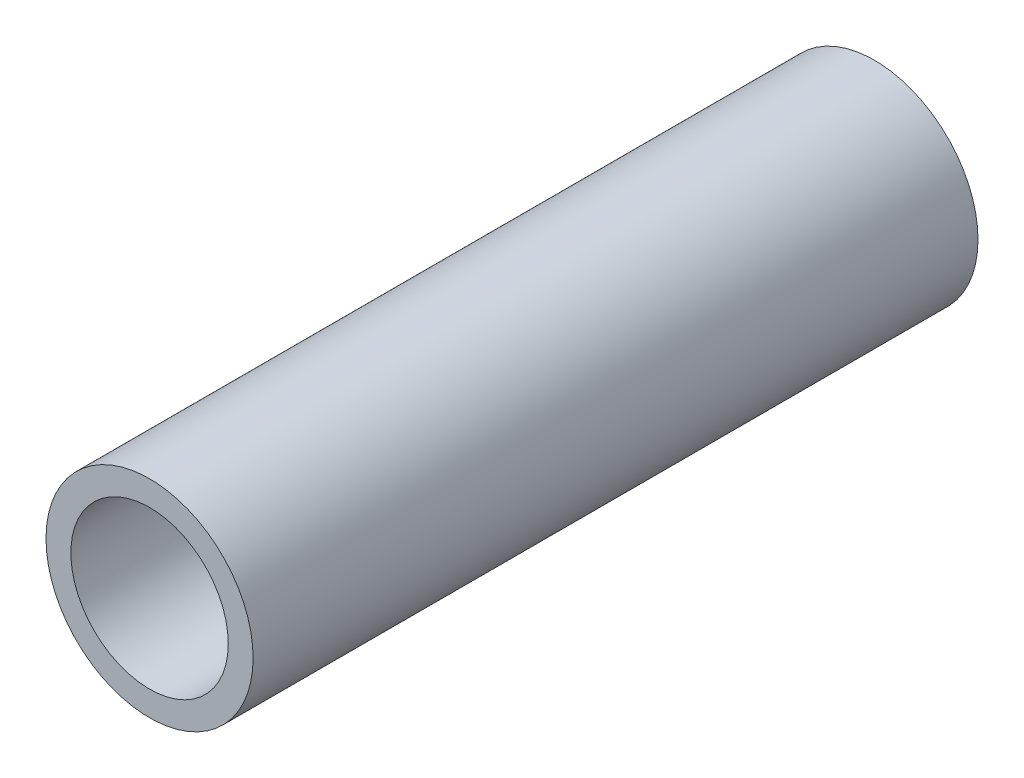
ISO-10303-21;
HEADER;
FILE_DESCRIPTION(('STEP AP214'),'2;1');
FILE_NAME('part.step','',(''),(''),'','','');
FILE_SCHEMA(('AUTOMOTIVE_DESIGN { 1 0 10303 214 1 1 1 1 }'));
ENDSEC;
DATA;
#1=APPLICATION_CONTEXT('core data for automotive mechanical design processes');
#2=APPLICATION_PROTOCOL_DEFINITION('international standard','automotive_design',2000,#1);
#3=PRODUCT_CONTEXT('',#1,'mechanical');
#4=PRODUCT('Part','Part','',(#3));
#5=PRODUCT_RELATED_PRODUCT_CATEGORY('part','',(#4));
#6=PRODUCT_DEFINITION_FORMATION('','',#4);
#7=PRODUCT_DEFINITION_CONTEXT('part definition',#1,'design');
#8=PRODUCT_DEFINITION('design','',#6,#7);
#9=PRODUCT_DEFINITION_SHAPE('','',#8);
#10=(LENGTH_UNIT() NAMED_UNIT(*) SI_UNIT(.MILLI.,.METRE.));
#11=(NAMED_UNIT(*) PLANE_ANGLE_UNIT() SI_UNIT($,.RADIAN.));
#12=(NAMED_UNIT(*) SI_UNIT($,.STERADIAN.) SOLID_ANGLE_UNIT());
#13=UNCERTAINTY_MEASURE_WITH_UNIT(LENGTH_MEASURE(1.E-05),#10,'distance_accuracy_value','');
#14=(GEOMETRIC_REPRESENTATION_CONTEXT(3) GLOBAL_UNCERTAINTY_ASSIGNED_CONTEXT((#13)) GLOBAL_UNIT_ASSIGNED_CONTEXT((#10,
#11,#12)) REPRESENTATION_CONTEXT('',''));
#15=CARTESIAN_POINT('',(0.,0.,0.));
#16=DIRECTION('',(0.,0.,1.));
#17=DIRECTION('',(1.,0.,0.));
#18=AXIS2_PLACEMENT_3D('',#15,#16,#17);
#19=CARTESIAN_POINT('',(0.,0.,0.));
#20=DIRECTION('',(0.,0.,1.));
#21=DIRECTION('',(1.,0.,0.));
#22=AXIS2_PLACEMENT_3D('',#19,#20,#21);
#23=PLANE('',#22);
#24=CARTESIAN_POINT('',(0.,0.,0.));
#25=DIRECTION('',(0.,0.,1.));
#26=DIRECTION('',(1.,0.,0.));
#27=AXIS2_PLACEMENT_3D('',#24,#25,#26);
#28=CIRCLE('',#27,10.);
#29=CARTESIAN_POINT('',(10.,0.,0.));
#30=VERTEX_POINT('',#29);
#31=EDGE_CURVE('E10',#30,#30,#28,.T.);
#32=ORIENTED_EDGE('',*,*,#31,.F.);
#33=EDGE_LOOP('',(#32));
#34=FACE_BOUND('',#33,.T.);
#35=CARTESIAN_POINT('',(0.,0.,0.));
#36=DIRECTION('',(0.,0.,1.));
#37=DIRECTION('',(1.,0.,0.));
#38=AXIS2_PLACEMENT_3D('',#35,#36,#37);
#39=CIRCLE('',#38,6.1);
#40=CARTESIAN_POINT('',(6.1,0.,0.));
#41=VERTEX_POINT('',#40);
#42=EDGE_CURVE('E38',#41,#41,#39,.T.);
#43=ORIENTED_EDGE('',*,*,#42,.T.);
#44=EDGE_LOOP('',(#43));
#45=FACE_BOUND('',#44,.T.);
#46=ADVANCED_FACE('F31',(#34,#45),#23,.F.);
#47=CARTESIAN_POINT('',(0.,0.,25.));
#48=DIRECTION('',(0.,0.,-1.));
#49=DIRECTION('',(-1.,0.,0.));
#50=AXIS2_PLACEMENT_3D('',#47,#48,#49);
#51=CYLINDRICAL_SURFACE('',#50,10.);
#52=ORIENTED_EDGE('',*,*,#31,.T.);
#53=EDGE_LOOP('',(#52));
#54=FACE_BOUND('',#53,.T.);
#55=CARTESIAN_POINT('',(0.,0.,70.));
#56=DIRECTION('',(0.,0.,1.));
#57=DIRECTION('',(1.,0.,0.));
#58=AXIS2_PLACEMENT_3D('',#55,#56,#57);
#59=CIRCLE('',#58,10.);
#60=CARTESIAN_POINT('',(10.,0.,70.));
#61=VERTEX_POINT('',#60);
#62=EDGE_CURVE('E42',#61,#61,#59,.T.);
#63=ORIENTED_EDGE('',*,*,#62,.F.);
#64=EDGE_LOOP('',(#63));
#65=FACE_BOUND('',#64,.T.);
#66=ADVANCED_FACE('F33',(#54,#65),#51,.T.);
#67=CARTESIAN_POINT('',(0.,0.,25.));
#68=DIRECTION('',(0.,0.,-1.));
#69=DIRECTION('',(-1.,0.,0.));
#70=AXIS2_PLACEMENT_3D('',#67,#68,#69);
#71=CYLINDRICAL_SURFACE('',#70,6.1);
#72=CARTESIAN_POINT('',(0.,0.,25.));
#73=DIRECTION('',(0.,0.,1.));
#74=DIRECTION('',(1.,0.,0.));
#75=AXIS2_PLACEMENT_3D('',#72,#73,#74);
#76=CIRCLE('',#75,6.1);
#77=CARTESIAN_POINT('',(6.1,0.,25.));
#78=VERTEX_POINT('',#77);
#79=EDGE_CURVE('E46',#78,#78,#76,.T.);
#80=ORIENTED_EDGE('',*,*,#79,.T.);
#81=EDGE_LOOP('',(#80));
#82=FACE_BOUND('',#81,.T.);
#83=ORIENTED_EDGE('',*,*,#42,.F.);
#84=EDGE_LOOP('',(#83));
#85=FACE_BOUND('',#84,.T.);
#86=ADVANCED_FACE('F69',(#82,#85),#71,.F.);
#87=CARTESIAN_POINT('',(0.,0.,70.));
#88=DIRECTION('',(0.,0.,1.));
#89=DIRECTION('',(1.,0.,0.));
#90=AXIS2_PLACEMENT_3D('',#87,#88,#89);
#91=PLANE('',#90);
#92=CARTESIAN_POINT('',(0.,0.,70.));
#93=DIRECTION('',(0.,0.,1.));
#94=DIRECTION('',(1.,0.,0.));
#95=AXIS2_PLACEMENT_3D('',#92,#93,#94);
#96=CIRCLE('',#95,7.6);
#97=CARTESIAN_POINT('',(7.6,0.,70.));
#98=VERTEX_POINT('',#97);
#99=EDGE_CURVE('E52',#98,#98,#96,.T.);
#100=ORIENTED_EDGE('',*,*,#99,.F.);
#101=EDGE_LOOP('',(#100));
#102=FACE_BOUND('',#101,.T.);
#103=ORIENTED_EDGE('',*,*,#62,.T.);
#104=EDGE_LOOP('',(#103));
#105=FACE_BOUND('',#104,.T.);
#106=ADVANCED_FACE('F63',(#102,#105),#91,.T.);
#107=CARTESIAN_POINT('',(0.,0.,25.));
#108=DIRECTION('',(0.,0.,1.));
#109=DIRECTION('',(1.,0.,0.));
#110=AXIS2_PLACEMENT_3D('',#107,#108,#109);
#111=CYLINDRICAL_SURFACE('',#110,7.6);
#112=CARTESIAN_POINT('',(0.,0.,25.));
#113=DIRECTION('',(0.,0.,1.));
#114=DIRECTION('',(1.,0.,0.));
#115=AXIS2_PLACEMENT_3D('',#112,#113,#114);
#116=CIRCLE('',#115,7.6);
#117=CARTESIAN_POINT('',(7.6,0.,25.));
#118=VERTEX_POINT('',#117);
#119=EDGE_CURVE('E50',#118,#118,#116,.T.);
#120=CARTESIAN_POINT('',(7.6,0.,25.));
#121=CARTESIAN_POINT('',(7.6,0.,25.46875));
#122=CARTESIAN_POINT('',(7.6,0.,25.9375));
#123=CARTESIAN_POINT('',(7.6,0.,26.875));
#124=CARTESIAN_POINT('',(7.6,0.,27.34375));
#125=CARTESIAN_POINT('',(7.6,0.,28.28125));
#126=CARTESIAN_POINT('',(7.6,0.,28.75));
#127=CARTESIAN_POINT('',(7.6,0.,29.6875));
#128=CARTESIAN_POINT('',(7.6,0.,30.15625));
#129=CARTESIAN_POINT('',(7.6,0.,31.09375));
#130=CARTESIAN_POINT('',(7.6,0.,31.5625));
#131=CARTESIAN_POINT('',(7.6,0.,32.5));
#132=CARTESIAN_POINT('',(7.6,0.,32.96875));
#133=CARTESIAN_POINT('',(7.6,0.,33.90625));
#134=CARTESIAN_POINT('',(7.6,0.,34.375));
#135=CARTESIAN_POINT('',(7.6,0.,35.3125));
#136=CARTESIAN_POINT('',(7.6,0.,35.78125));
#137=CARTESIAN_POINT('',(7.6,0.,36.71875));
#138=CARTESIAN_POINT('',(7.6,0.,37.1875));
#139=CARTESIAN_POINT('',(7.6,0.,38.125));
#140=CARTESIAN_POINT('',(7.6,0.,38.59375));
#141=CARTESIAN_POINT('',(7.6,0.,39.53125));
#142=CARTESIAN_POINT('',(7.6,0.,40.));
#143=CARTESIAN_POINT('',(7.6,0.,40.9375));
#144=CARTESIAN_POINT('',(7.6,0.,41.40625));
#145=CARTESIAN_POINT('',(7.6,0.,42.34375));
#146=CARTESIAN_POINT('',(7.6,0.,42.8125));
#147=CARTESIAN_POINT('',(7.6,0.,43.75));
#148=CARTESIAN_POINT('',(7.6,0.,44.21875));
#149=CARTESIAN_POINT('',(7.6,0.,45.15625));
#150=CARTESIAN_POINT('',(7.6,0.,45.625));
#151=CARTESIAN_POINT('',(7.6,0.,46.5625));
#152=CARTESIAN_POINT('',(7.6,0.,47.03125));
#153=CARTESIAN_POINT('',(7.6,0.,47.96875));
#154=CARTESIAN_POINT('',(7.6,0.,48.4375));
#155=CARTESIAN_POINT('',(7.6,0.,49.375));
#156=CARTESIAN_POINT('',(7.6,0.,49.84375));
#157=CARTESIAN_POINT('',(7.6,0.,50.78125));
#158=CARTESIAN_POINT('',(7.6,0.,51.25));
#159=CARTESIAN_POINT('',(7.6,0.,52.1875));
#160=CARTESIAN_POINT('',(7.6,0.,52.65625));
#161=CARTESIAN_POINT('',(7.6,0.,53.59375));
#162=CARTESIAN_POINT('',(7.6,0.,54.0625));
#163=CARTESIAN_POINT('',(7.6,0.,55.));
#164=CARTESIAN_POINT('',(7.6,0.,55.46875));
#165=CARTESIAN_POINT('',(7.6,0.,56.40625));
#166=CARTESIAN_POINT('',(7.6,0.,56.875));
#167=CARTESIAN_POINT('',(7.6,0.,57.8125));
#168=CARTESIAN_POINT('',(7.6,0.,58.28125));
#169=CARTESIAN_POINT('',(7.6,0.,59.21875));
#170=CARTESIAN_POINT('',(7.6,0.,59.6875));
#171=CARTESIAN_POINT('',(7.6,0.,60.625));
#172=CARTESIAN_POINT('',(7.6,0.,61.09375));
#173=CARTESIAN_POINT('',(7.6,0.,62.03125));
#174=CARTESIAN_POINT('',(7.6,0.,62.5));
#175=CARTESIAN_POINT('',(7.6,0.,63.4375));
#176=CARTESIAN_POINT('',(7.6,0.,63.90625));
#177=CARTESIAN_POINT('',(7.6,0.,64.84375));
#178=CARTESIAN_POINT('',(7.6,0.,65.3125));
#179=CARTESIAN_POINT('',(7.6,0.,66.25));
#180=CARTESIAN_POINT('',(7.6,0.,66.71875));
#181=CARTESIAN_POINT('',(7.6,0.,67.65625));
#182=CARTESIAN_POINT('',(7.6,0.,68.125));
#183=CARTESIAN_POINT('',(7.6,0.,69.0625));
#184=CARTESIAN_POINT('',(7.6,0.,69.53125));
#185=CARTESIAN_POINT('',(7.6,0.,70.));
#186=B_SPLINE_CURVE_WITH_KNOTS('',3,(#120,#121,#122,#123,#124,#125,#126,#127,#128,#129,#130,
#131,#132,#133,#134,#135,#136,#137,#138,#139,#140,#141,#142,#143,#144,#145,#146,#147,#148,#149,
#150,#151,#152,#153,#154,#155,#156,#157,#158,#159,#160,#161,#162,#163,#164,#165,#166,#167,#168,
#169,#170,#171,#172,#173,#174,#175,#176,#177,#178,#179,#180,#181,#182,#183,#184,#185),
.UNSPECIFIED.,.F.,.F.,(4,2,2,2,2,2,2,2,2,2,2,2,2,2,2,2,2,2,2,2,2,2,2,2,2,2,2,2,2,2,2,2,4),(0.,
1.40625,2.8125,4.21875,5.625,7.03125,8.4375,9.84375,11.25,12.65625,14.0625,15.46875,16.875,
18.28125,19.6875,21.09375,22.5,23.90625,25.3125,26.71875,28.125,29.53125,30.9375,32.34375,33.75,
35.15625,36.5625,37.96875,39.375,40.78125,42.1875,43.59375,45.),.UNSPECIFIED.);
#187=EDGE_CURVE('BSEAM60',#118,#98,#186,.T.);
#188=ORIENTED_EDGE('',*,*,#119,.F.);
#189=ORIENTED_EDGE('',*,*,#99,.T.);
#190=ORIENTED_EDGE('',*,*,#187,.T.);
#191=ORIENTED_EDGE('',*,*,#187,.F.);
#192=EDGE_LOOP('',(#188,#190,#189,#191));
#193=FACE_BOUND('',#192,.T.);
#194=ADVANCED_FACE('F60',(#193),#111,.F.);
#195=CARTESIAN_POINT('',(0.,0.,25.));
#196=DIRECTION('',(0.,0.,1.));
#197=DIRECTION('',(1.,0.,0.));
#198=AXIS2_PLACEMENT_3D('',#195,#196,#197);
#199=PLANE('',#198);
#200=ORIENTED_EDGE('',*,*,#79,.F.);
#201=EDGE_LOOP('',(#200));
#202=FACE_BOUND('',#201,.T.);
#203=ORIENTED_EDGE('',*,*,#119,.T.);
#204=EDGE_LOOP('',(#203));
#205=FACE_BOUND('',#204,.T.);
#206=ADVANCED_FACE('F58',(#202,#205),#199,.T.);
#207=CLOSED_SHELL('',(#46,#66,#86,#106,#194,#206));
#208=MANIFOLD_SOLID_BREP('B2',#207);
#209=ADVANCED_BREP_SHAPE_REPRESENTATION('',(#18,#208),#14);
#210=SHAPE_DEFINITION_REPRESENTATION(#9,#209);
ENDSEC;
END-ISO-10303-21;
